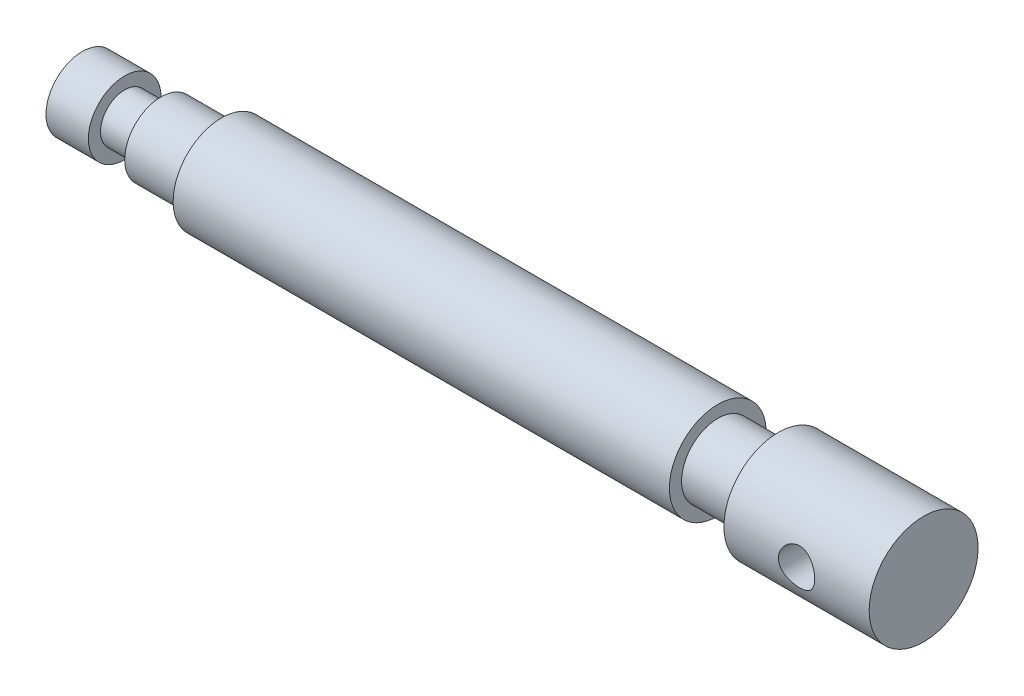
ISO-10303-21;
HEADER;
FILE_DESCRIPTION(('STEP AP214'),'2;1');
FILE_NAME('part.step','',(''),(''),'','','');
FILE_SCHEMA(('AUTOMOTIVE_DESIGN { 1 0 10303 214 1 1 1 1 }'));
ENDSEC;
DATA;
#1=APPLICATION_CONTEXT('core data for automotive mechanical design processes');
#2=APPLICATION_PROTOCOL_DEFINITION('international standard','automotive_design',2000,#1);
#3=PRODUCT_CONTEXT('',#1,'mechanical');
#4=PRODUCT('Part','Part','',(#3));
#5=PRODUCT_RELATED_PRODUCT_CATEGORY('part','',(#4));
#6=PRODUCT_DEFINITION_FORMATION('','',#4);
#7=PRODUCT_DEFINITION_CONTEXT('part definition',#1,'design');
#8=PRODUCT_DEFINITION('design','',#6,#7);
#9=PRODUCT_DEFINITION_SHAPE('','',#8);
#10=(LENGTH_UNIT() NAMED_UNIT(*) SI_UNIT(.MILLI.,.METRE.));
#11=(NAMED_UNIT(*) PLANE_ANGLE_UNIT() SI_UNIT($,.RADIAN.));
#12=(NAMED_UNIT(*) SI_UNIT($,.STERADIAN.) SOLID_ANGLE_UNIT());
#13=UNCERTAINTY_MEASURE_WITH_UNIT(LENGTH_MEASURE(1.E-05),#10,'distance_accuracy_value','');
#14=(GEOMETRIC_REPRESENTATION_CONTEXT(3) GLOBAL_UNCERTAINTY_ASSIGNED_CONTEXT((#13)) GLOBAL_UNIT_ASSIGNED_CONTEXT((#10,
#11,#12)) REPRESENTATION_CONTEXT('',''));
#15=CARTESIAN_POINT('',(0.,0.,0.));
#16=DIRECTION('',(0.,0.,1.));
#17=DIRECTION('',(1.,0.,0.));
#18=AXIS2_PLACEMENT_3D('',#15,#16,#17);
#19=CARTESIAN_POINT('',(0.,0.,0.));
#20=DIRECTION('',(1.,0.,0.));
#21=DIRECTION('',(0.,0.,-1.));
#22=AXIS2_PLACEMENT_3D('',#19,#20,#21);
#23=PLANE('',#22);
#24=CARTESIAN_POINT('',(0.,0.,0.));
#25=DIRECTION('',(-1.,0.,0.));
#26=DIRECTION('',(0.,0.,1.));
#27=AXIS2_PLACEMENT_3D('',#24,#25,#26);
#28=CIRCLE('',#27,6.);
#29=CARTESIAN_POINT('',(0.,0.,6.));
#30=VERTEX_POINT('',#29);
#31=EDGE_CURVE('E49',#30,#30,#28,.T.);
#32=ORIENTED_EDGE('',*,*,#31,.T.);
#33=EDGE_LOOP('',(#32));
#34=FACE_BOUND('',#33,.T.);
#35=ADVANCED_FACE('F34',(#34),#23,.F.);
#36=CARTESIAN_POINT('',(0.,0.,0.));
#37=DIRECTION('',(-1.,0.,0.));
#38=DIRECTION('',(0.,0.,1.));
#39=AXIS2_PLACEMENT_3D('',#36,#37,#38);
#40=CYLINDRICAL_SURFACE('',#39,6.);
#41=ORIENTED_EDGE('',*,*,#31,.F.);
#42=EDGE_LOOP('',(#41));
#43=FACE_BOUND('',#42,.T.);
#44=CARTESIAN_POINT('',(7.,0.,0.));
#45=DIRECTION('',(-1.,0.,0.));
#46=DIRECTION('',(0.,0.,1.));
#47=AXIS2_PLACEMENT_3D('',#44,#45,#46);
#48=CIRCLE('',#47,6.);
#49=CARTESIAN_POINT('',(7.,0.,6.));
#50=VERTEX_POINT('',#49);
#51=EDGE_CURVE('E53',#50,#50,#48,.T.);
#52=ORIENTED_EDGE('',*,*,#51,.T.);
#53=EDGE_LOOP('',(#52));
#54=FACE_BOUND('',#53,.T.);
#55=ADVANCED_FACE('F77',(#43,#54),#40,.T.);
#56=CARTESIAN_POINT('',(7.,6.,0.));
#57=DIRECTION('',(-1.,0.,0.));
#58=DIRECTION('',(0.,0.,1.));
#59=AXIS2_PLACEMENT_3D('',#56,#57,#58);
#60=PLANE('',#59);
#61=ORIENTED_EDGE('',*,*,#51,.F.);
#62=EDGE_LOOP('',(#61));
#63=FACE_BOUND('',#62,.T.);
#64=CARTESIAN_POINT('',(7.,0.,0.));
#65=DIRECTION('',(-1.,0.,0.));
#66=DIRECTION('',(0.,0.,1.));
#67=AXIS2_PLACEMENT_3D('',#64,#65,#66);
#68=CIRCLE('',#67,4.);
#69=CARTESIAN_POINT('',(7.,0.,4.));
#70=VERTEX_POINT('',#69);
#71=EDGE_CURVE('E89',#70,#70,#68,.T.);
#72=ORIENTED_EDGE('',*,*,#71,.T.);
#73=EDGE_LOOP('',(#72));
#74=FACE_BOUND('',#73,.T.);
#75=ADVANCED_FACE('F82',(#63,#74),#60,.F.);
#76=CARTESIAN_POINT('',(0.,0.,0.));
#77=DIRECTION('',(-1.,0.,0.));
#78=DIRECTION('',(0.,0.,1.));
#79=AXIS2_PLACEMENT_3D('',#76,#77,#78);
#80=CYLINDRICAL_SURFACE('',#79,4.);
#81=ORIENTED_EDGE('',*,*,#71,.F.);
#82=EDGE_LOOP('',(#81));
#83=FACE_BOUND('',#82,.T.);
#84=CARTESIAN_POINT('',(13.,0.,0.));
#85=DIRECTION('',(-1.,0.,0.));
#86=DIRECTION('',(0.,0.,1.));
#87=AXIS2_PLACEMENT_3D('',#84,#85,#86);
#88=CIRCLE('',#87,4.);
#89=CARTESIAN_POINT('',(13.,0.,4.));
#90=VERTEX_POINT('',#89);
#91=EDGE_CURVE('E91',#90,#90,#88,.T.);
#92=ORIENTED_EDGE('',*,*,#91,.T.);
#93=EDGE_LOOP('',(#92));
#94=FACE_BOUND('',#93,.T.);
#95=ADVANCED_FACE('F152',(#83,#94),#80,.T.);
#96=CARTESIAN_POINT('',(13.,4.,0.));
#97=DIRECTION('',(1.,0.,0.));
#98=DIRECTION('',(0.,0.,-1.));
#99=AXIS2_PLACEMENT_3D('',#96,#97,#98);
#100=PLANE('',#99);
#101=ORIENTED_EDGE('',*,*,#91,.F.);
#102=EDGE_LOOP('',(#101));
#103=FACE_BOUND('',#102,.T.);
#104=CARTESIAN_POINT('',(13.,0.,0.));
#105=DIRECTION('',(-1.,0.,0.));
#106=DIRECTION('',(0.,0.,1.));
#107=AXIS2_PLACEMENT_3D('',#104,#105,#106);
#108=CIRCLE('',#107,6.);
#109=CARTESIAN_POINT('',(13.,0.,6.));
#110=VERTEX_POINT('',#109);
#111=EDGE_CURVE('E96',#110,#110,#108,.T.);
#112=ORIENTED_EDGE('',*,*,#111,.T.);
#113=EDGE_LOOP('',(#112));
#114=FACE_BOUND('',#113,.T.);
#115=ADVANCED_FACE('F148',(#103,#114),#100,.F.);
#116=CARTESIAN_POINT('',(0.,0.,0.));
#117=DIRECTION('',(-1.,0.,0.));
#118=DIRECTION('',(0.,0.,1.));
#119=AXIS2_PLACEMENT_3D('',#116,#117,#118);
#120=CYLINDRICAL_SURFACE('',#119,6.);
#121=ORIENTED_EDGE('',*,*,#111,.F.);
#122=EDGE_LOOP('',(#121));
#123=FACE_BOUND('',#122,.T.);
#124=CARTESIAN_POINT('',(23.,0.,0.));
#125=DIRECTION('',(-1.,0.,0.));
#126=DIRECTION('',(0.,0.,1.));
#127=AXIS2_PLACEMENT_3D('',#124,#125,#126);
#128=CIRCLE('',#127,6.);
#129=CARTESIAN_POINT('',(23.,0.,6.));
#130=VERTEX_POINT('',#129);
#131=EDGE_CURVE('E99',#130,#130,#128,.T.);
#132=ORIENTED_EDGE('',*,*,#131,.T.);
#133=EDGE_LOOP('',(#132));
#134=FACE_BOUND('',#133,.T.);
#135=ADVANCED_FACE('F144',(#123,#134),#120,.T.);
#136=CARTESIAN_POINT('',(23.,6.,0.));
#137=DIRECTION('',(1.,0.,0.));
#138=DIRECTION('',(0.,0.,-1.));
#139=AXIS2_PLACEMENT_3D('',#136,#137,#138);
#140=PLANE('',#139);
#141=ORIENTED_EDGE('',*,*,#131,.F.);
#142=EDGE_LOOP('',(#141));
#143=FACE_BOUND('',#142,.T.);
#144=CARTESIAN_POINT('',(23.,0.,0.));
#145=DIRECTION('',(-1.,0.,0.));
#146=DIRECTION('',(0.,0.,1.));
#147=AXIS2_PLACEMENT_3D('',#144,#145,#146);
#148=CIRCLE('',#147,8.);
#149=CARTESIAN_POINT('',(23.,0.,8.));
#150=VERTEX_POINT('',#149);
#151=EDGE_CURVE('E102',#150,#150,#148,.T.);
#152=ORIENTED_EDGE('',*,*,#151,.T.);
#153=EDGE_LOOP('',(#152));
#154=FACE_BOUND('',#153,.T.);
#155=ADVANCED_FACE('F140',(#143,#154),#140,.F.);
#156=CARTESIAN_POINT('',(0.,0.,0.));
#157=DIRECTION('',(-1.,0.,0.));
#158=DIRECTION('',(0.,0.,1.));
#159=AXIS2_PLACEMENT_3D('',#156,#157,#158);
#160=CYLINDRICAL_SURFACE('',#159,8.);
#161=ORIENTED_EDGE('',*,*,#151,.F.);
#162=EDGE_LOOP('',(#161));
#163=FACE_BOUND('',#162,.T.);
#164=CARTESIAN_POINT('',(105.,0.,0.));
#165=DIRECTION('',(-1.,0.,0.));
#166=DIRECTION('',(0.,0.,1.));
#167=AXIS2_PLACEMENT_3D('',#164,#165,#166);
#168=CIRCLE('',#167,8.);
#169=CARTESIAN_POINT('',(105.,0.,8.));
#170=VERTEX_POINT('',#169);
#171=EDGE_CURVE('E105',#170,#170,#168,.T.);
#172=ORIENTED_EDGE('',*,*,#171,.T.);
#173=EDGE_LOOP('',(#172));
#174=FACE_BOUND('',#173,.T.);
#175=ADVANCED_FACE('F136',(#163,#174),#160,.T.);
#176=CARTESIAN_POINT('',(105.,8.,0.));
#177=DIRECTION('',(-1.,0.,0.));
#178=DIRECTION('',(0.,0.,1.));
#179=AXIS2_PLACEMENT_3D('',#176,#177,#178);
#180=PLANE('',#179);
#181=ORIENTED_EDGE('',*,*,#171,.F.);
#182=EDGE_LOOP('',(#181));
#183=FACE_BOUND('',#182,.T.);
#184=CARTESIAN_POINT('',(105.,0.,0.));
#185=DIRECTION('',(-1.,0.,0.));
#186=DIRECTION('',(0.,0.,1.));
#187=AXIS2_PLACEMENT_3D('',#184,#185,#186);
#188=CIRCLE('',#187,6.);
#189=CARTESIAN_POINT('',(105.,0.,6.));
#190=VERTEX_POINT('',#189);
#191=EDGE_CURVE('E108',#190,#190,#188,.T.);
#192=ORIENTED_EDGE('',*,*,#191,.T.);
#193=EDGE_LOOP('',(#192));
#194=FACE_BOUND('',#193,.T.);
#195=ADVANCED_FACE('F129',(#183,#194),#180,.F.);
#196=CARTESIAN_POINT('',(0.,0.,0.));
#197=DIRECTION('',(-1.,0.,0.));
#198=DIRECTION('',(0.,0.,1.));
#199=AXIS2_PLACEMENT_3D('',#196,#197,#198);
#200=CYLINDRICAL_SURFACE('',#199,6.);
#201=ORIENTED_EDGE('',*,*,#191,.F.);
#202=EDGE_LOOP('',(#201));
#203=FACE_BOUND('',#202,.T.);
#204=CARTESIAN_POINT('',(115.,0.,0.));
#205=DIRECTION('',(-1.,0.,0.));
#206=DIRECTION('',(0.,0.,1.));
#207=AXIS2_PLACEMENT_3D('',#204,#205,#206);
#208=CIRCLE('',#207,6.);
#209=CARTESIAN_POINT('',(115.,0.,6.));
#210=VERTEX_POINT('',#209);
#211=EDGE_CURVE('E111',#210,#210,#208,.T.);
#212=ORIENTED_EDGE('',*,*,#211,.T.);
#213=EDGE_LOOP('',(#212));
#214=FACE_BOUND('',#213,.T.);
#215=ADVANCED_FACE('F124',(#203,#214),#200,.T.);
#216=CARTESIAN_POINT('',(115.,9.,0.));
#217=DIRECTION('',(1.,0.,0.));
#218=DIRECTION('',(0.,0.,-1.));
#219=AXIS2_PLACEMENT_3D('',#216,#217,#218);
#220=PLANE('',#219);
#221=ORIENTED_EDGE('',*,*,#211,.F.);
#222=EDGE_LOOP('',(#221));
#223=FACE_BOUND('',#222,.T.);
#224=CARTESIAN_POINT('',(115.,0.,0.));
#225=DIRECTION('',(-1.,0.,0.));
#226=DIRECTION('',(0.,0.,1.));
#227=AXIS2_PLACEMENT_3D('',#224,#225,#226);
#228=CIRCLE('',#227,9.);
#229=CARTESIAN_POINT('',(115.,0.,9.));
#230=VERTEX_POINT('',#229);
#231=EDGE_CURVE('E114',#230,#230,#228,.T.);
#232=ORIENTED_EDGE('',*,*,#231,.T.);
#233=EDGE_LOOP('',(#232));
#234=FACE_BOUND('',#233,.T.);
#235=ADVANCED_FACE('F74',(#223,#234),#220,.F.);
#236=CARTESIAN_POINT('',(0.,0.,0.));
#237=DIRECTION('',(-1.,0.,0.));
#238=DIRECTION('',(0.,0.,1.));
#239=AXIS2_PLACEMENT_3D('',#236,#237,#238);
#240=CYLINDRICAL_SURFACE('',#239,9.);
#241=CARTESIAN_POINT('',(130.,0.,-9.));
#242=CARTESIAN_POINT('',(130.000000761195,0.163690088660168,-9.00000045902832));
#243=CARTESIAN_POINT('',(129.986559201618,0.327375583615647,-8.99549308522634));
#244=CARTESIAN_POINT('',(129.933312673548,0.649925282618914,-8.97795630609842));
#245=CARTESIAN_POINT('',(129.893504968153,0.808788984356453,-8.96492601606458));
#246=CARTESIAN_POINT('',(129.789042269848,1.11699836850533,-8.93175923719328));
#247=CARTESIAN_POINT('',(129.724428812622,1.2663594776581,-8.9116346319256));
#248=CARTESIAN_POINT('',(129.572376481485,1.55212481041598,-8.86633337152025));
#249=CARTESIAN_POINT('',(129.484933104992,1.68852647087612,-8.84115572003334));
#250=CARTESIAN_POINT('',(129.286522585424,1.9492250250668,-8.78742283329015));
#251=CARTESIAN_POINT('',(129.174906297219,2.07301110089493,-8.75878669391354));
#252=CARTESIAN_POINT('',(128.93269853588,2.30049807810625,-8.70180944349364));
#253=CARTESIAN_POINT('',(128.802102895214,2.40419455646839,-8.67346839871647));
#254=CARTESIAN_POINT('',(128.521044654411,2.59147482668358,-8.61939997431821));
#255=CARTESIAN_POINT('',(128.370118780804,2.6743945746631,-8.59377117827064));
#256=CARTESIAN_POINT('',(128.055471716624,2.81345662163316,-8.54925916255803));
#257=CARTESIAN_POINT('',(127.891754448512,2.86960709216029,-8.53037388482237));
#258=CARTESIAN_POINT('',(127.56198033551,2.95162038452748,-8.50233909808132));
#259=CARTESIAN_POINT('',(127.396188374533,2.9784403448153,-8.49288287308834));
#260=CARTESIAN_POINT('',(127.062208737532,3.00402337000343,-8.48386969888523));
#261=CARTESIAN_POINT('',(126.894021817872,3.00279510481415,-8.4843096906819));
#262=CARTESIAN_POINT('',(126.568190108668,2.97305971111025,-8.49477045024541));
#263=CARTESIAN_POINT('',(126.410414791243,2.94580173950098,-8.50435247602599));
#264=CARTESIAN_POINT('',(126.101819741179,2.86681848854825,-8.53129973173653));
#265=CARTESIAN_POINT('',(125.951000843695,2.81509027977561,-8.54866589352323));
#266=CARTESIAN_POINT('',(125.657761751226,2.68781717418063,-8.58953733393746));
#267=CARTESIAN_POINT('',(125.515515923591,2.61190214612178,-8.61313697379352));
#268=CARTESIAN_POINT('',(125.245387275161,2.43866731890941,-8.66377675727179));
#269=CARTESIAN_POINT('',(125.1175086192,2.34134133709201,-8.69081789371391));
#270=CARTESIAN_POINT('',(124.872725205518,2.12204799804671,-8.74701987503223));
#271=CARTESIAN_POINT('',(124.756741916473,1.99905945022893,-8.77621768064529));
#272=CARTESIAN_POINT('',(124.54680620001,1.73501870991019,-8.8322081516111));
#273=CARTESIAN_POINT('',(124.452855885507,1.59396478698244,-8.85900058614202));
#274=CARTESIAN_POINT('',(124.288911099295,1.2958428391388,-8.90751323813381));
#275=CARTESIAN_POINT('',(124.219163525978,1.138629829249,-8.92918050024118));
#276=CARTESIAN_POINT('',(124.107390478133,0.813807250093516,-8.96461701433304));
#277=CARTESIAN_POINT('',(124.06535537373,0.646201314464853,-8.97838900964638));
#278=CARTESIAN_POINT('',(124.011833001933,0.313151488587904,-8.99602881214321));
#279=CARTESIAN_POINT('',(123.999100572482,0.147928799594532,-9.00030005501184));
#280=CARTESIAN_POINT('',(124.000998020795,-0.182325209880718,-8.99966708084482));
#281=CARTESIAN_POINT('',(124.01562327994,-0.347356557958956,-8.99476441258087));
#282=CARTESIAN_POINT('',(124.070835723208,-0.667559598912772,-8.97660074151313));
#283=CARTESIAN_POINT('',(124.110658618148,-0.822878420504537,-8.96358596133577));
#284=CARTESIAN_POINT('',(124.2141803334,-1.12456787573873,-8.9307554049021));
#285=CARTESIAN_POINT('',(124.277882198403,-1.27093736552582,-8.91093876140025));
#286=CARTESIAN_POINT('',(124.429211295522,-1.55486488917982,-8.86586793861869));
#287=CARTESIAN_POINT('',(124.51742377985,-1.69208987765145,-8.84048444267358));
#288=CARTESIAN_POINT('',(124.71458245004,-1.95019449040676,-8.78715761748787));
#289=CARTESIAN_POINT('',(124.823534968095,-2.07106910338673,-8.75921350781483));
#290=CARTESIAN_POINT('',(125.06493625302,-2.29875752341889,-8.70230543941334));
#291=CARTESIAN_POINT('',(125.198227680781,-2.40468290773731,-8.67335283262283));
#292=CARTESIAN_POINT('',(125.481314703433,-2.59277256697072,-8.61899919884126));
#293=CARTESIAN_POINT('',(125.631110435902,-2.67493664379304,-8.59359820146007));
#294=CARTESIAN_POINT('',(125.94301904587,-2.81279079124908,-8.54947175374151));
#295=CARTESIAN_POINT('',(126.105106237506,-2.86853439649506,-8.53073282378936));
#296=CARTESIAN_POINT('',(126.437135950132,-2.95168400027806,-8.50232496919348));
#297=CARTESIAN_POINT('',(126.607074896213,-2.97910276486182,-8.49265195870918));
#298=CARTESIAN_POINT('',(126.940591288123,-3.00382884743202,-8.48393576622532));
#299=CARTESIAN_POINT('',(127.10404702086,-3.00261077192519,-8.48437200772246));
#300=CARTESIAN_POINT('',(127.428295224766,-2.97372688034607,-8.49453809471602));
#301=CARTESIAN_POINT('',(127.589087853865,-2.94606263837575,-8.50426738708085));
#302=CARTESIAN_POINT('',(127.900406989007,-2.86611543938802,-8.53153572914676));
#303=CARTESIAN_POINT('',(128.051070475014,-2.81431003804652,-8.54892294067433));
#304=CARTESIAN_POINT('',(128.341682220815,-2.68793809727922,-8.58949196455406));
#305=CARTESIAN_POINT('',(128.481628093564,-2.6133665056614,-8.6126750629018));
#306=CARTESIAN_POINT('',(128.753451009769,-2.43978207775028,-8.66348487678139));
#307=CARTESIAN_POINT('',(128.884709505695,-2.33984472829373,-8.69126134926411));
#308=CARTESIAN_POINT('',(129.129069440153,-2.11992864940694,-8.74750068849759));
#309=CARTESIAN_POINT('',(129.242165727064,-1.99994425335444,-8.77596374737117));
#310=CARTESIAN_POINT('',(129.451433236868,-1.73772467076206,-8.83170091576632));
#311=CARTESIAN_POINT('',(129.546773043253,-1.59480454049917,-8.8588854540377));
#312=CARTESIAN_POINT('',(129.711971286552,-1.29407207221985,-8.90777973517836));
#313=CARTESIAN_POINT('',(129.781836237766,-1.13626355439703,-8.9294908772379));
#314=CARTESIAN_POINT('',(129.891164897466,-0.81748094160291,-8.96416545205626));
#315=CARTESIAN_POINT('',(129.93184739879,-0.656963273029212,-8.97747637267568));
#316=CARTESIAN_POINT('',(129.986260842031,-0.330961248030734,-8.99539221192665));
#317=CARTESIAN_POINT('',(129.99999923049,-0.165478276706236,-8.99999953595715));
#318=CARTESIAN_POINT('',(130.,0.,-9.));
#319=B_SPLINE_CURVE_WITH_KNOTS('',3,(#241,#242,#243,#244,#245,#246,#247,#248,#249,#250,#251,
#252,#253,#254,#255,#256,#257,#258,#259,#260,#261,#262,#263,#264,#265,#266,#267,#268,#269,#270,
#271,#272,#273,#274,#275,#276,#277,#278,#279,#280,#281,#282,#283,#284,#285,#286,#287,#288,#289,
#290,#291,#292,#293,#294,#295,#296,#297,#298,#299,#300,#301,#302,#303,#304,#305,#306,#307,#308,
#309,#310,#311,#312,#313,#314,#315,#316,#317,#318),.UNSPECIFIED.,.T.,.F.,(4,2,2,2,2,2,2,2,2,2,2,
2,2,2,2,2,2,2,2,2,2,2,2,2,2,2,2,2,2,2,2,2,2,2,2,2,2,2,4),(0.,0.490461318078029,
0.980973555802563,1.47066801861083,1.96045913339731,2.46554052848269,2.97073299862591,
3.49045154470411,4.01001134078499,4.51205777225523,5.01394901962458,5.49290479653841,
5.97191792566445,6.45864513465391,6.94551307674621,7.457799174341,7.97013437899854,
8.48755216951072,9.00479006631624,9.49960749525508,9.99434139492528,10.4747447393464,
10.9552093585231,11.4483119953121,11.9415654246567,12.4572306864225,12.9729002470499,
13.4875204148031,14.0019085411752,14.4898699819277,14.9778023805413,15.4564676124125,
15.9352391452793,16.4349020007541,16.9347063337133,17.453989825053,17.9731404345737,
18.4690967512144,18.9649159811442),.UNSPECIFIED.);
#320=CARTESIAN_POINT('',(130.,0.,-9.));
#321=VERTEX_POINT('',#320);
#322=EDGE_CURVE('E10',#321,#321,#319,.T.);
#323=ORIENTED_EDGE('',*,*,#322,.T.);
#324=EDGE_LOOP('',(#323));
#325=FACE_BOUND('',#324,.T.);
#326=CARTESIAN_POINT('',(130.,0.,9.));
#327=CARTESIAN_POINT('',(130.000000761195,-0.163690088660168,9.00000045902832));
#328=CARTESIAN_POINT('',(129.986559201618,-0.327375583615647,8.99549308522634));
#329=CARTESIAN_POINT('',(129.933312673548,-0.649925282618914,8.97795630609842));
#330=CARTESIAN_POINT('',(129.893504968153,-0.808788984356453,8.96492601606458));
#331=CARTESIAN_POINT('',(129.789042269848,-1.11699836850533,8.93175923719328));
#332=CARTESIAN_POINT('',(129.724428812622,-1.2663594776581,8.9116346319256));
#333=CARTESIAN_POINT('',(129.572376481485,-1.55212481041598,8.86633337152025));
#334=CARTESIAN_POINT('',(129.484933104992,-1.68852647087612,8.84115572003334));
#335=CARTESIAN_POINT('',(129.286522585424,-1.9492250250668,8.78742283329015));
#336=CARTESIAN_POINT('',(129.174906297219,-2.07301110089493,8.75878669391354));
#337=CARTESIAN_POINT('',(128.93269853588,-2.30049807810625,8.70180944349364));
#338=CARTESIAN_POINT('',(128.802102895214,-2.40419455646839,8.67346839871647));
#339=CARTESIAN_POINT('',(128.521044654411,-2.59147482668358,8.61939997431821));
#340=CARTESIAN_POINT('',(128.370118780804,-2.6743945746631,8.59377117827064));
#341=CARTESIAN_POINT('',(128.055471716624,-2.81345662163316,8.54925916255803));
#342=CARTESIAN_POINT('',(127.891754448512,-2.86960709216029,8.53037388482237));
#343=CARTESIAN_POINT('',(127.56198033551,-2.95162038452748,8.50233909808132));
#344=CARTESIAN_POINT('',(127.396188374533,-2.9784403448153,8.49288287308834));
#345=CARTESIAN_POINT('',(127.062208737532,-3.00402337000343,8.48386969888523));
#346=CARTESIAN_POINT('',(126.894021817872,-3.00279510481415,8.4843096906819));
#347=CARTESIAN_POINT('',(126.568190108668,-2.97305971111025,8.49477045024541));
#348=CARTESIAN_POINT('',(126.410414791243,-2.94580173950098,8.50435247602599));
#349=CARTESIAN_POINT('',(126.101819741179,-2.86681848854825,8.53129973173653));
#350=CARTESIAN_POINT('',(125.951000843695,-2.81509027977561,8.54866589352323));
#351=CARTESIAN_POINT('',(125.657761751226,-2.68781717418063,8.58953733393746));
#352=CARTESIAN_POINT('',(125.515515923591,-2.61190214612178,8.61313697379352));
#353=CARTESIAN_POINT('',(125.245387275161,-2.43866731890941,8.66377675727179));
#354=CARTESIAN_POINT('',(125.1175086192,-2.34134133709201,8.69081789371391));
#355=CARTESIAN_POINT('',(124.872725205518,-2.12204799804671,8.74701987503223));
#356=CARTESIAN_POINT('',(124.756741916473,-1.99905945022893,8.77621768064529));
#357=CARTESIAN_POINT('',(124.54680620001,-1.73501870991019,8.8322081516111));
#358=CARTESIAN_POINT('',(124.452855885507,-1.59396478698244,8.85900058614202));
#359=CARTESIAN_POINT('',(124.288911099295,-1.2958428391388,8.90751323813381));
#360=CARTESIAN_POINT('',(124.219163525978,-1.138629829249,8.92918050024118));
#361=CARTESIAN_POINT('',(124.107390478133,-0.813807250093516,8.96461701433304));
#362=CARTESIAN_POINT('',(124.06535537373,-0.646201314464853,8.97838900964638));
#363=CARTESIAN_POINT('',(124.011833001933,-0.313151488587904,8.99602881214321));
#364=CARTESIAN_POINT('',(123.999100572482,-0.147928799594532,9.00030005501184));
#365=CARTESIAN_POINT('',(124.000998020795,0.182325209880718,8.99966708084482));
#366=CARTESIAN_POINT('',(124.01562327994,0.347356557958956,8.99476441258087));
#367=CARTESIAN_POINT('',(124.070835723208,0.667559598912772,8.97660074151313));
#368=CARTESIAN_POINT('',(124.110658618148,0.822878420504537,8.96358596133577));
#369=CARTESIAN_POINT('',(124.2141803334,1.12456787573873,8.9307554049021));
#370=CARTESIAN_POINT('',(124.277882198403,1.27093736552582,8.91093876140025));
#371=CARTESIAN_POINT('',(124.429211295522,1.55486488917982,8.86586793861869));
#372=CARTESIAN_POINT('',(124.51742377985,1.69208987765145,8.84048444267358));
#373=CARTESIAN_POINT('',(124.71458245004,1.95019449040676,8.78715761748787));
#374=CARTESIAN_POINT('',(124.823534968095,2.07106910338673,8.75921350781483));
#375=CARTESIAN_POINT('',(125.06493625302,2.29875752341889,8.70230543941334));
#376=CARTESIAN_POINT('',(125.198227680781,2.40468290773731,8.67335283262283));
#377=CARTESIAN_POINT('',(125.481314703433,2.59277256697072,8.61899919884126));
#378=CARTESIAN_POINT('',(125.631110435902,2.67493664379304,8.59359820146007));
#379=CARTESIAN_POINT('',(125.94301904587,2.81279079124908,8.54947175374151));
#380=CARTESIAN_POINT('',(126.105106237506,2.86853439649506,8.53073282378936));
#381=CARTESIAN_POINT('',(126.437135950132,2.95168400027806,8.50232496919348));
#382=CARTESIAN_POINT('',(126.607074896213,2.97910276486182,8.49265195870918));
#383=CARTESIAN_POINT('',(126.940591288123,3.00382884743202,8.48393576622532));
#384=CARTESIAN_POINT('',(127.10404702086,3.00261077192519,8.48437200772246));
#385=CARTESIAN_POINT('',(127.428295224766,2.97372688034607,8.49453809471602));
#386=CARTESIAN_POINT('',(127.589087853865,2.94606263837575,8.50426738708085));
#387=CARTESIAN_POINT('',(127.900406989007,2.86611543938802,8.53153572914676));
#388=CARTESIAN_POINT('',(128.051070475014,2.81431003804652,8.54892294067433));
#389=CARTESIAN_POINT('',(128.341682220815,2.68793809727922,8.58949196455406));
#390=CARTESIAN_POINT('',(128.481628093564,2.6133665056614,8.6126750629018));
#391=CARTESIAN_POINT('',(128.753451009769,2.43978207775028,8.66348487678139));
#392=CARTESIAN_POINT('',(128.884709505695,2.33984472829373,8.69126134926411));
#393=CARTESIAN_POINT('',(129.129069440153,2.11992864940694,8.74750068849759));
#394=CARTESIAN_POINT('',(129.242165727064,1.99994425335444,8.77596374737117));
#395=CARTESIAN_POINT('',(129.451433236868,1.73772467076206,8.83170091576632));
#396=CARTESIAN_POINT('',(129.546773043253,1.59480454049917,8.8588854540377));
#397=CARTESIAN_POINT('',(129.711971286552,1.29407207221985,8.90777973517836));
#398=CARTESIAN_POINT('',(129.781836237766,1.13626355439703,8.9294908772379));
#399=CARTESIAN_POINT('',(129.891164897466,0.81748094160291,8.96416545205626));
#400=CARTESIAN_POINT('',(129.93184739879,0.656963273029212,8.97747637267568));
#401=CARTESIAN_POINT('',(129.986260842031,0.330961248030734,8.99539221192665));
#402=CARTESIAN_POINT('',(129.99999923049,0.165478276706236,8.99999953595715));
#403=CARTESIAN_POINT('',(130.,0.,9.));
#404=B_SPLINE_CURVE_WITH_KNOTS('',3,(#326,#327,#328,#329,#330,#331,#332,#333,#334,#335,#336,
#337,#338,#339,#340,#341,#342,#343,#344,#345,#346,#347,#348,#349,#350,#351,#352,#353,#354,#355,
#356,#357,#358,#359,#360,#361,#362,#363,#364,#365,#366,#367,#368,#369,#370,#371,#372,#373,#374,
#375,#376,#377,#378,#379,#380,#381,#382,#383,#384,#385,#386,#387,#388,#389,#390,#391,#392,#393,
#394,#395,#396,#397,#398,#399,#400,#401,#402,#403),.UNSPECIFIED.,.T.,.F.,(4,2,2,2,2,2,2,2,2,2,2,
2,2,2,2,2,2,2,2,2,2,2,2,2,2,2,2,2,2,2,2,2,2,2,2,2,2,2,4),(0.,0.490461318078029,
0.980973555802563,1.47066801861083,1.96045913339731,2.46554052848269,2.97073299862591,
3.49045154470411,4.01001134078499,4.51205777225523,5.01394901962458,5.49290479653841,
5.97191792566445,6.45864513465391,6.94551307674621,7.457799174341,7.97013437899854,
8.48755216951072,9.00479006631624,9.49960749525508,9.99434139492528,10.4747447393464,
10.9552093585231,11.4483119953121,11.9415654246567,12.4572306864225,12.9729002470499,
13.4875204148031,14.0019085411752,14.4898699819277,14.9778023805413,15.4564676124125,
15.9352391452793,16.4349020007541,16.9347063337133,17.453989825053,17.9731404345737,
18.4690967512144,18.9649159811442),.UNSPECIFIED.);
#405=CARTESIAN_POINT('',(130.,0.,9.));
#406=VERTEX_POINT('',#405);
#407=EDGE_CURVE('E45',#406,#406,#404,.T.);
#408=ORIENTED_EDGE('',*,*,#407,.T.);
#409=EDGE_LOOP('',(#408));
#410=FACE_BOUND('',#409,.T.);
#411=ORIENTED_EDGE('',*,*,#231,.F.);
#412=EDGE_LOOP('',(#411));
#413=FACE_BOUND('',#412,.T.);
#414=CARTESIAN_POINT('',(139.,0.,0.));
#415=DIRECTION('',(-1.,0.,0.));
#416=DIRECTION('',(0.,0.,1.));
#417=AXIS2_PLACEMENT_3D('',#414,#415,#416);
#418=CIRCLE('',#417,9.);
#419=CARTESIAN_POINT('',(139.,0.,9.));
#420=VERTEX_POINT('',#419);
#421=EDGE_CURVE('E117',#420,#420,#418,.T.);
#422=ORIENTED_EDGE('',*,*,#421,.T.);
#423=EDGE_LOOP('',(#422));
#424=FACE_BOUND('',#423,.T.);
#425=ADVANCED_FACE('F59',(#325,#410,#413,#424),#240,.T.);
#426=CARTESIAN_POINT('',(139.,9.,0.));
#427=DIRECTION('',(-1.,0.,0.));
#428=DIRECTION('',(0.,0.,1.));
#429=AXIS2_PLACEMENT_3D('',#426,#427,#428);
#430=PLANE('',#429);
#431=ORIENTED_EDGE('',*,*,#421,.F.);
#432=EDGE_LOOP('',(#431));
#433=FACE_BOUND('',#432,.T.);
#434=ADVANCED_FACE('F66',(#433),#430,.F.);
#435=CARTESIAN_POINT('',(127.,0.,-9.));
#436=DIRECTION('',(0.,0.,1.));
#437=DIRECTION('',(1.,0.,0.));
#438=AXIS2_PLACEMENT_3D('',#435,#436,#437);
#439=CYLINDRICAL_SURFACE('',#438,2.99999999999999);
#440=ORIENTED_EDGE('',*,*,#407,.F.);
#441=EDGE_LOOP('',(#440));
#442=FACE_BOUND('',#441,.T.);
#443=ORIENTED_EDGE('',*,*,#322,.F.);
#444=EDGE_LOOP('',(#443));
#445=FACE_BOUND('',#444,.T.);
#446=ADVANCED_FACE('F63',(#442,#445),#439,.F.);
#447=CLOSED_SHELL('',(#35,#55,#75,#95,#115,#135,#155,#175,#195,#215,#235,#425,#434,#446));
#448=MANIFOLD_SOLID_BREP('B2',#447);
#449=ADVANCED_BREP_SHAPE_REPRESENTATION('',(#18,#448),#14);
#450=SHAPE_DEFINITION_REPRESENTATION(#9,#449);
ENDSEC;
END-ISO-10303-21;
